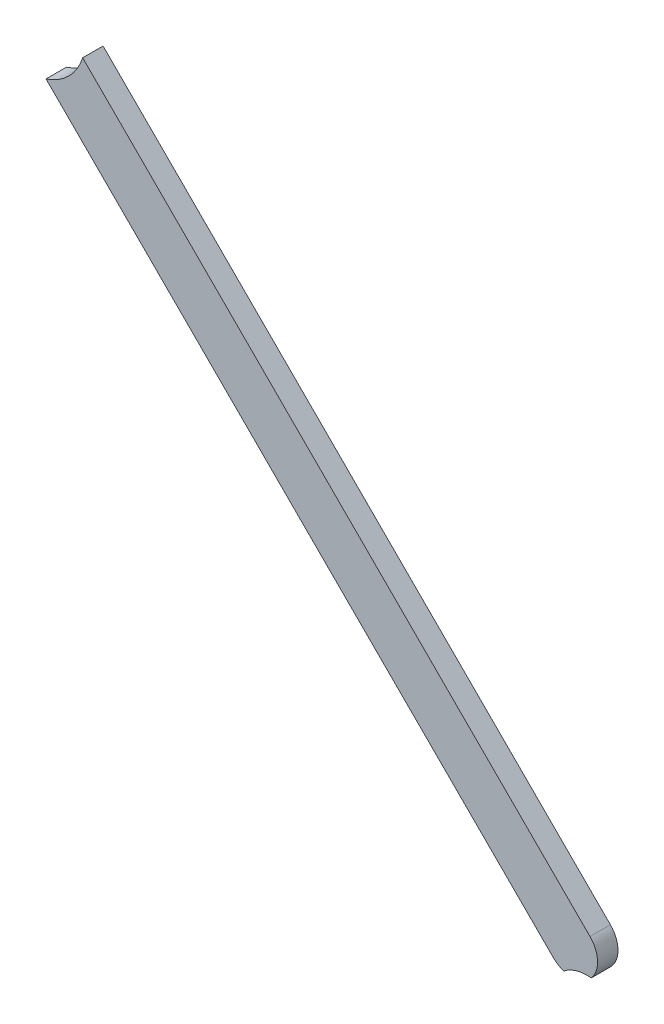
ISO-10303-21;
HEADER;
FILE_DESCRIPTION(('STEP AP214'),'2;1');
FILE_NAME('part.step','',(''),(''),'','','');
FILE_SCHEMA(('AUTOMOTIVE_DESIGN { 1 0 10303 214 1 1 1 1 }'));
ENDSEC;
DATA;
#1=APPLICATION_CONTEXT('core data for automotive mechanical design processes');
#2=APPLICATION_PROTOCOL_DEFINITION('international standard','automotive_design',2000,#1);
#3=PRODUCT_CONTEXT('',#1,'mechanical');
#4=PRODUCT('Part','Part','',(#3));
#5=PRODUCT_RELATED_PRODUCT_CATEGORY('part','',(#4));
#6=PRODUCT_DEFINITION_FORMATION('','',#4);
#7=PRODUCT_DEFINITION_CONTEXT('part definition',#1,'design');
#8=PRODUCT_DEFINITION('design','',#6,#7);
#9=PRODUCT_DEFINITION_SHAPE('','',#8);
#10=(LENGTH_UNIT() NAMED_UNIT(*) SI_UNIT(.MILLI.,.METRE.));
#11=(NAMED_UNIT(*) PLANE_ANGLE_UNIT() SI_UNIT($,.RADIAN.));
#12=(NAMED_UNIT(*) SI_UNIT($,.STERADIAN.) SOLID_ANGLE_UNIT());
#13=UNCERTAINTY_MEASURE_WITH_UNIT(LENGTH_MEASURE(1.E-05),#10,'distance_accuracy_value','');
#14=(GEOMETRIC_REPRESENTATION_CONTEXT(3) GLOBAL_UNCERTAINTY_ASSIGNED_CONTEXT((#13)) GLOBAL_UNIT_ASSIGNED_CONTEXT((#10,
#11,#12)) REPRESENTATION_CONTEXT('',''));
#15=CARTESIAN_POINT('',(0.,0.,0.));
#16=DIRECTION('',(0.,0.,1.));
#17=DIRECTION('',(1.,0.,0.));
#18=AXIS2_PLACEMENT_3D('',#15,#16,#17);
#19=CARTESIAN_POINT('',(113.954064664847,103.230461595153,0.));
#20=DIRECTION('',(0.707106781186549,0.707106781186547,0.));
#21=DIRECTION('',(0.707106781186547,-0.707106781186549,0.));
#22=AXIS2_PLACEMENT_3D('',#19,#20,#21);
#23=PLANE('',#22);
#24=DIRECTION('',(0.707106781186547,-0.707106781186549,0.));
#25=VECTOR('',#24,1.);
#26=CARTESIAN_POINT('',(113.60512966,103.5793966,0.1999996));
#27=LINE('',#26,#25);
#28=CARTESIAN_POINT('',(113.954064664847,103.230461595153,0.1999996));
#29=VERTEX_POINT('',#28);
#30=CARTESIAN_POINT('',(118.92759552,98.25693074,0.1999996));
#31=VERTEX_POINT('',#30);
#32=EDGE_CURVE('E11',#29,#31,#27,.T.);
#33=ORIENTED_EDGE('',*,*,#32,.F.);
#34=DIRECTION('',(0.,0.,1.));
#35=VECTOR('',#34,1.);
#36=CARTESIAN_POINT('',(113.954064664847,103.230461595153,0.));
#37=LINE('',#36,#35);
#38=CARTESIAN_POINT('',(113.954064664847,103.230461595153,0.));
#39=VERTEX_POINT('',#38);
#40=EDGE_CURVE('E24',#39,#29,#37,.T.);
#41=ORIENTED_EDGE('',*,*,#40,.F.);
#42=DIRECTION('',(0.707106781186547,-0.707106781186549,0.));
#43=VECTOR('',#42,1.);
#44=CARTESIAN_POINT('',(113.60512966,103.5793966,0.));
#45=LINE('',#44,#43);
#46=CARTESIAN_POINT('',(118.92759552,98.25693074,0.));
#47=VERTEX_POINT('',#46);
#48=EDGE_CURVE('E88',#39,#47,#45,.T.);
#49=ORIENTED_EDGE('',*,*,#48,.T.);
#50=DIRECTION('',(0.,0.,1.));
#51=VECTOR('',#50,1.);
#52=CARTESIAN_POINT('',(118.92759552,98.25693074,0.));
#53=LINE('',#52,#51);
#54=EDGE_CURVE('E37',#47,#31,#53,.T.);
#55=ORIENTED_EDGE('',*,*,#54,.T.);
#56=EDGE_LOOP('',(#33,#41,#49,#55));
#57=FACE_BOUND('',#56,.T.);
#58=ADVANCED_FACE('F17',(#57),#23,.F.);
#59=CARTESIAN_POINT('',(119.10720019,98.43653541,0.));
#60=DIRECTION('',(0.,0.,-1.));
#61=DIRECTION('',(-0.70710678118652,-0.707106781186576,0.));
#62=AXIS2_PLACEMENT_3D('',#59,#60,#61);
#63=CYLINDRICAL_SURFACE('',#62,0.253999360179546);
#64=CARTESIAN_POINT('',(119.10720019,98.43653541,0.1999996));
#65=DIRECTION('',(0.,0.,1.));
#66=DIRECTION('',(-0.70710678118652,-0.707106781186576,0.));
#67=AXIS2_PLACEMENT_3D('',#64,#65,#66);
#68=CIRCLE('',#67,0.253999360179546);
#69=CARTESIAN_POINT('',(119.03050319809,98.1943923811854,0.1999996));
#70=VERTEX_POINT('',#69);
#71=EDGE_CURVE('E111',#31,#70,#68,.T.);
#72=ORIENTED_EDGE('',*,*,#71,.F.);
#73=ORIENTED_EDGE('',*,*,#54,.F.);
#74=CARTESIAN_POINT('',(119.10720019,98.43653541,0.));
#75=DIRECTION('',(0.,0.,1.));
#76=DIRECTION('',(-0.70710678118652,-0.707106781186576,0.));
#77=AXIS2_PLACEMENT_3D('',#74,#75,#76);
#78=CIRCLE('',#77,0.253999360179546);
#79=CARTESIAN_POINT('',(119.03050319809,98.1943923811854,0.));
#80=VERTEX_POINT('',#79);
#81=EDGE_CURVE('E108',#47,#80,#78,.T.);
#82=ORIENTED_EDGE('',*,*,#81,.T.);
#83=DIRECTION('',(0.,0.,1.));
#84=VECTOR('',#83,1.);
#85=CARTESIAN_POINT('',(119.03050319809,98.1943923811854,0.));
#86=LINE('',#85,#84);
#87=EDGE_CURVE('E106',#80,#70,#86,.T.);
#88=ORIENTED_EDGE('',*,*,#87,.T.);
#89=EDGE_LOOP('',(#72,#73,#82,#88));
#90=FACE_BOUND('',#89,.T.);
#91=ADVANCED_FACE('F118',(#90),#63,.T.);
#92=CARTESIAN_POINT('',(119.253,97.917,0.));
#93=DIRECTION('',(0.,0.,-1.));
#94=DIRECTION('',(1.,0.,0.));
#95=AXIS2_PLACEMENT_3D('',#92,#93,#94);
#96=CYLINDRICAL_SURFACE('',#95,0.3556);
#97=DIRECTION('',(0.,0.,1.));
#98=VECTOR('',#97,1.);
#99=CARTESIAN_POINT('',(119.298683949299,98.26965328125,0.));
#100=LINE('',#99,#98);
#101=CARTESIAN_POINT('',(119.298683949299,98.26965328125,0.));
#102=VERTEX_POINT('',#101);
#103=CARTESIAN_POINT('',(119.298683949299,98.26965328125,0.1999996));
#104=VERTEX_POINT('',#103);
#105=EDGE_CURVE('E104',#102,#104,#100,.T.);
#106=ORIENTED_EDGE('',*,*,#105,.T.);
#107=CARTESIAN_POINT('',(119.253,97.917,0.1999996));
#108=DIRECTION('',(0.,0.,1.));
#109=DIRECTION('',(1.,0.,0.));
#110=AXIS2_PLACEMENT_3D('',#107,#108,#109);
#111=CIRCLE('',#110,0.3556);
#112=EDGE_CURVE('E101',#104,#70,#111,.T.);
#113=ORIENTED_EDGE('',*,*,#112,.T.);
#114=ORIENTED_EDGE('',*,*,#87,.F.);
#115=CARTESIAN_POINT('',(119.253,97.917,0.));
#116=DIRECTION('',(0.,0.,1.));
#117=DIRECTION('',(1.,0.,0.));
#118=AXIS2_PLACEMENT_3D('',#115,#116,#117);
#119=CIRCLE('',#118,0.3556);
#120=EDGE_CURVE('E98',#102,#80,#119,.T.);
#121=ORIENTED_EDGE('',*,*,#120,.F.);
#122=EDGE_LOOP('',(#106,#113,#114,#121));
#123=FACE_BOUND('',#122,.T.);
#124=ADVANCED_FACE('F124',(#123),#96,.F.);
#125=CARTESIAN_POINT('',(119.10720019,98.43653541,0.));
#126=DIRECTION('',(0.,0.,-1.));
#127=DIRECTION('',(-0.70710678118652,-0.707106781186576,0.));
#128=AXIS2_PLACEMENT_3D('',#125,#126,#127);
#129=CYLINDRICAL_SURFACE('',#128,0.253999360179546);
#130=CARTESIAN_POINT('',(119.10720019,98.43653541,0.1999996));
#131=DIRECTION('',(0.,0.,1.));
#132=DIRECTION('',(-0.70710678118652,-0.707106781186576,0.));
#133=AXIS2_PLACEMENT_3D('',#130,#131,#132);
#134=CIRCLE('',#133,0.253999360179546);
#135=CARTESIAN_POINT('',(119.28680486,98.61614008,0.1999996));
#136=VERTEX_POINT('',#135);
#137=EDGE_CURVE('E95',#104,#136,#134,.T.);
#138=ORIENTED_EDGE('',*,*,#137,.F.);
#139=ORIENTED_EDGE('',*,*,#105,.F.);
#140=CARTESIAN_POINT('',(119.28680486,98.61614008,0.));
#141=VERTEX_POINT('',#140);
#142=EDGE_CURVE('E94',#102,#141,#78,.T.);
#143=ORIENTED_EDGE('',*,*,#142,.T.);
#144=DIRECTION('',(0.,0.,1.));
#145=VECTOR('',#144,1.);
#146=CARTESIAN_POINT('',(119.28680486,98.61614008,0.));
#147=LINE('',#146,#145);
#148=EDGE_CURVE('E79',#141,#136,#147,.T.);
#149=ORIENTED_EDGE('',*,*,#148,.T.);
#150=EDGE_LOOP('',(#138,#139,#143,#149));
#151=FACE_BOUND('',#150,.T.);
#152=ADVANCED_FACE('F126',(#151),#129,.T.);
#153=CARTESIAN_POINT('',(119.28680486,98.61614008,0.));
#154=DIRECTION('',(-0.707106781186548,-0.707106781186548,0.));
#155=DIRECTION('',(-0.707106781186548,0.707106781186548,0.));
#156=AXIS2_PLACEMENT_3D('',#153,#154,#155);
#157=PLANE('',#156);
#158=DIRECTION('',(-0.707106781186548,0.707106781186548,0.));
#159=VECTOR('',#158,1.);
#160=CARTESIAN_POINT('',(119.28680486,98.61614008,0.1999996));
#161=LINE('',#160,#159);
#162=CARTESIAN_POINT('',(114.313274004847,103.589670935153,0.1999996));
#163=VERTEX_POINT('',#162);
#164=EDGE_CURVE('E83',#136,#163,#161,.T.);
#165=ORIENTED_EDGE('',*,*,#164,.F.);
#166=ORIENTED_EDGE('',*,*,#148,.F.);
#167=DIRECTION('',(-0.707106781186548,0.707106781186548,0.));
#168=VECTOR('',#167,1.);
#169=CARTESIAN_POINT('',(119.28680486,98.61614008,0.));
#170=LINE('',#169,#168);
#171=CARTESIAN_POINT('',(114.313274004847,103.589670935153,0.));
#172=VERTEX_POINT('',#171);
#173=EDGE_CURVE('E75',#141,#172,#170,.T.);
#174=ORIENTED_EDGE('',*,*,#173,.T.);
#175=DIRECTION('',(0.,0.,1.));
#176=VECTOR('',#175,1.);
#177=CARTESIAN_POINT('',(114.313274004847,103.589670935153,0.));
#178=LINE('',#177,#176);
#179=EDGE_CURVE('E65',#172,#163,#178,.T.);
#180=ORIENTED_EDGE('',*,*,#179,.T.);
#181=EDGE_LOOP('',(#165,#166,#174,#180));
#182=FACE_BOUND('',#181,.T.);
#183=ADVANCED_FACE('F78',(#182),#157,.F.);
#184=CARTESIAN_POINT('',(113.7847356,103.759,0.));
#185=DIRECTION('',(0.,0.,-1.));
#186=DIRECTION('',(1.,0.,0.));
#187=AXIS2_PLACEMENT_3D('',#184,#185,#186);
#188=CYLINDRICAL_SURFACE('',#187,0.55500016);
#189=ORIENTED_EDGE('',*,*,#40,.T.);
#190=CARTESIAN_POINT('',(113.7847356,103.759,0.1999996));
#191=DIRECTION('',(0.,0.,1.));
#192=DIRECTION('',(1.,0.,0.));
#193=AXIS2_PLACEMENT_3D('',#190,#191,#192);
#194=CIRCLE('',#193,0.55500016);
#195=EDGE_CURVE('E71',#29,#163,#194,.T.);
#196=ORIENTED_EDGE('',*,*,#195,.T.);
#197=ORIENTED_EDGE('',*,*,#179,.F.);
#198=CARTESIAN_POINT('',(113.7847356,103.759,0.));
#199=DIRECTION('',(0.,0.,1.));
#200=DIRECTION('',(1.,0.,0.));
#201=AXIS2_PLACEMENT_3D('',#198,#199,#200);
#202=CIRCLE('',#201,0.55500016);
#203=EDGE_CURVE('E69',#39,#172,#202,.T.);
#204=ORIENTED_EDGE('',*,*,#203,.F.);
#205=EDGE_LOOP('',(#189,#196,#197,#204));
#206=FACE_BOUND('',#205,.T.);
#207=ADVANCED_FACE('F67',(#206),#188,.F.);
#208=CARTESIAN_POINT('',(113.60512966,103.5793966,0.));
#209=DIRECTION('',(0.,0.,-1.));
#210=DIRECTION('',(-1.,0.,0.));
#211=AXIS2_PLACEMENT_3D('',#208,#209,#210);
#212=PLANE('',#211);
#213=ORIENTED_EDGE('',*,*,#48,.F.);
#214=ORIENTED_EDGE('',*,*,#203,.T.);
#215=ORIENTED_EDGE('',*,*,#173,.F.);
#216=ORIENTED_EDGE('',*,*,#142,.F.);
#217=ORIENTED_EDGE('',*,*,#120,.T.);
#218=ORIENTED_EDGE('',*,*,#81,.F.);
#219=EDGE_LOOP('',(#213,#214,#215,#216,#217,#218));
#220=FACE_BOUND('',#219,.T.);
#221=ADVANCED_FACE('F86',(#220),#212,.T.);
#222=CARTESIAN_POINT('',(113.60512966,103.5793966,0.1999996));
#223=DIRECTION('',(0.,0.,-1.));
#224=DIRECTION('',(-1.,0.,0.));
#225=AXIS2_PLACEMENT_3D('',#222,#223,#224);
#226=PLANE('',#225);
#227=ORIENTED_EDGE('',*,*,#195,.F.);
#228=ORIENTED_EDGE('',*,*,#32,.T.);
#229=ORIENTED_EDGE('',*,*,#71,.T.);
#230=ORIENTED_EDGE('',*,*,#112,.F.);
#231=ORIENTED_EDGE('',*,*,#137,.T.);
#232=ORIENTED_EDGE('',*,*,#164,.T.);
#233=EDGE_LOOP('',(#227,#228,#229,#230,#231,#232));
#234=FACE_BOUND('',#233,.T.);
#235=ADVANCED_FACE('F121',(#234),#226,.F.);
#236=CLOSED_SHELL('',(#58,#91,#124,#152,#183,#207,#221,#235));
#237=MANIFOLD_SOLID_BREP('B1',#236);
#238=ADVANCED_BREP_SHAPE_REPRESENTATION('',(#18,#237),#14);
#239=SHAPE_DEFINITION_REPRESENTATION(#9,#238);
ENDSEC;
END-ISO-10303-21;
